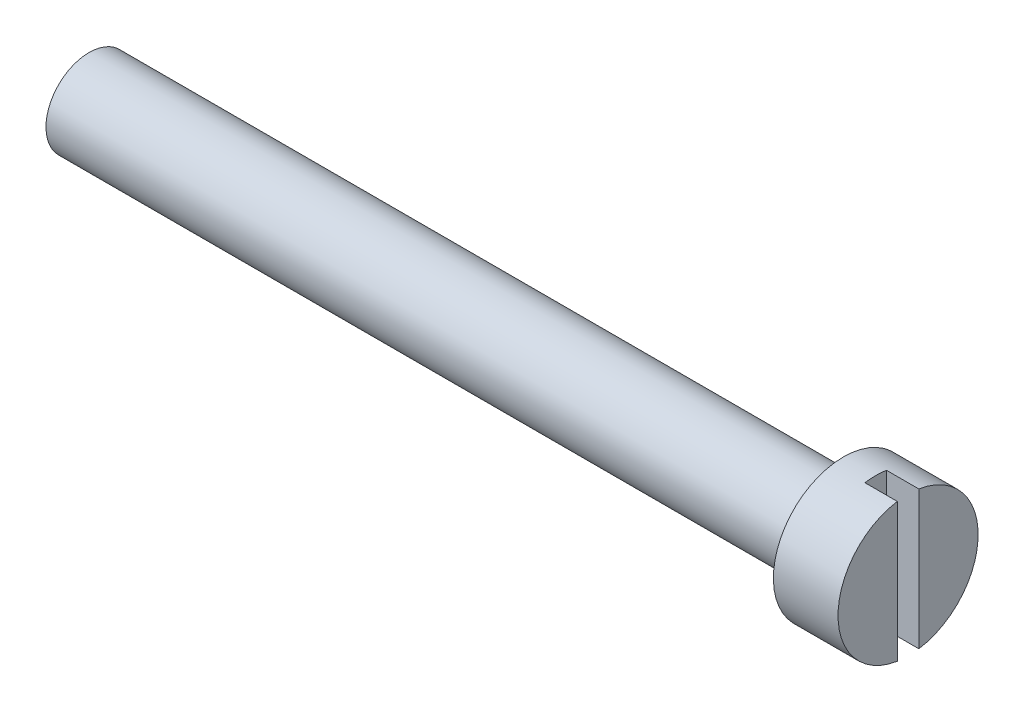
ISO-10303-21;
HEADER;
FILE_DESCRIPTION(('STEP AP214'),'2;1');
FILE_NAME('part.step','',(''),(''),'','','');
FILE_SCHEMA(('AUTOMOTIVE_DESIGN { 1 0 10303 214 1 1 1 1 }'));
ENDSEC;
DATA;
#1=APPLICATION_CONTEXT('core data for automotive mechanical design processes');
#2=APPLICATION_PROTOCOL_DEFINITION('international standard','automotive_design',2000,#1);
#3=PRODUCT_CONTEXT('',#1,'mechanical');
#4=PRODUCT('Part','Part','',(#3));
#5=PRODUCT_RELATED_PRODUCT_CATEGORY('part','',(#4));
#6=PRODUCT_DEFINITION_FORMATION('','',#4);
#7=PRODUCT_DEFINITION_CONTEXT('part definition',#1,'design');
#8=PRODUCT_DEFINITION('design','',#6,#7);
#9=PRODUCT_DEFINITION_SHAPE('','',#8);
#10=(LENGTH_UNIT() NAMED_UNIT(*) SI_UNIT(.MILLI.,.METRE.));
#11=(NAMED_UNIT(*) PLANE_ANGLE_UNIT() SI_UNIT($,.RADIAN.));
#12=(NAMED_UNIT(*) SI_UNIT($,.STERADIAN.) SOLID_ANGLE_UNIT());
#13=UNCERTAINTY_MEASURE_WITH_UNIT(LENGTH_MEASURE(1.E-05),#10,'distance_accuracy_value','');
#14=(GEOMETRIC_REPRESENTATION_CONTEXT(3) GLOBAL_UNCERTAINTY_ASSIGNED_CONTEXT((#13)) GLOBAL_UNIT_ASSIGNED_CONTEXT((#10,
#11,#12)) REPRESENTATION_CONTEXT('',''));
#15=CARTESIAN_POINT('',(0.,0.,0.));
#16=DIRECTION('',(0.,0.,1.));
#17=DIRECTION('',(1.,0.,0.));
#18=AXIS2_PLACEMENT_3D('',#15,#16,#17);
#19=CARTESIAN_POINT('',(0.,3.25,0.));
#20=DIRECTION('',(1.,0.,0.));
#21=DIRECTION('',(0.,1.,0.));
#22=AXIS2_PLACEMENT_3D('',#19,#20,#21);
#23=PLANE('',#22);
#24=DIRECTION('',(0.,1.,0.));
#25=VECTOR('',#24,1.);
#26=CARTESIAN_POINT('',(0.,-3.25,-0.5));
#27=LINE('',#26,#25);
#28=CARTESIAN_POINT('',(0.,-3.21130814466628,-0.5));
#29=VERTEX_POINT('',#28);
#30=CARTESIAN_POINT('',(0.,3.21130814466628,-0.5));
#31=VERTEX_POINT('',#30);
#32=EDGE_CURVE('E88',#29,#31,#27,.T.);
#33=ORIENTED_EDGE('',*,*,#32,.F.);
#34=CARTESIAN_POINT('',(0.,0.,0.));
#35=DIRECTION('',(1.,0.,0.));
#36=DIRECTION('',(0.,1.,0.));
#37=AXIS2_PLACEMENT_3D('',#34,#35,#36);
#38=CIRCLE('',#37,3.25);
#39=EDGE_CURVE('E99',#29,#31,#38,.T.);
#40=ORIENTED_EDGE('',*,*,#39,.T.);
#41=EDGE_LOOP('',(#33,#40));
#42=FACE_BOUND('',#41,.T.);
#43=ADVANCED_FACE('F45',(#42),#23,.T.);
#44=DIRECTION('',(0.,-1.,0.));
#45=VECTOR('',#44,1.);
#46=CARTESIAN_POINT('',(0.,-3.25,0.5));
#47=LINE('',#46,#45);
#48=CARTESIAN_POINT('',(0.,3.21130814466628,0.5));
#49=VERTEX_POINT('',#48);
#50=CARTESIAN_POINT('',(0.,-3.21130814466628,0.5));
#51=VERTEX_POINT('',#50);
#52=EDGE_CURVE('E101',#49,#51,#47,.T.);
#53=ORIENTED_EDGE('',*,*,#52,.F.);
#54=EDGE_CURVE('E106',#49,#51,#38,.T.);
#55=ORIENTED_EDGE('',*,*,#54,.T.);
#56=EDGE_LOOP('',(#53,#55));
#57=FACE_BOUND('',#56,.T.);
#58=ADVANCED_FACE('F47',(#57),#23,.T.);
#59=CARTESIAN_POINT('',(-38.,0.,0.));
#60=DIRECTION('',(-1.,0.,0.));
#61=DIRECTION('',(0.,-1.,0.));
#62=AXIS2_PLACEMENT_3D('',#59,#60,#61);
#63=PLANE('',#62);
#64=CARTESIAN_POINT('',(-38.,0.,0.));
#65=DIRECTION('',(1.,0.,0.));
#66=DIRECTION('',(0.,1.,0.));
#67=AXIS2_PLACEMENT_3D('',#64,#65,#66);
#68=CIRCLE('',#67,2.);
#69=CARTESIAN_POINT('',(-38.,2.,0.));
#70=VERTEX_POINT('',#69);
#71=EDGE_CURVE('E122',#70,#70,#68,.T.);
#72=ORIENTED_EDGE('',*,*,#71,.F.);
#73=EDGE_LOOP('',(#72));
#74=FACE_BOUND('',#73,.T.);
#75=ADVANCED_FACE('F154',(#74),#63,.T.);
#76=CARTESIAN_POINT('',(0.,0.,0.));
#77=DIRECTION('',(1.,0.,0.));
#78=DIRECTION('',(0.,1.,0.));
#79=AXIS2_PLACEMENT_3D('',#76,#77,#78);
#80=CYLINDRICAL_SURFACE('',#79,2.);
#81=ORIENTED_EDGE('',*,*,#71,.T.);
#82=EDGE_LOOP('',(#81));
#83=FACE_BOUND('',#82,.T.);
#84=CARTESIAN_POINT('',(-3.,0.,0.));
#85=DIRECTION('',(1.,0.,0.));
#86=DIRECTION('',(0.,1.,0.));
#87=AXIS2_PLACEMENT_3D('',#84,#85,#86);
#88=CIRCLE('',#87,2.);
#89=CARTESIAN_POINT('',(-3.,2.,0.));
#90=VERTEX_POINT('',#89);
#91=EDGE_CURVE('E118',#90,#90,#88,.T.);
#92=ORIENTED_EDGE('',*,*,#91,.F.);
#93=EDGE_LOOP('',(#92));
#94=FACE_BOUND('',#93,.T.);
#95=ADVANCED_FACE('F159',(#83,#94),#80,.T.);
#96=CARTESIAN_POINT('',(-3.,2.,0.));
#97=DIRECTION('',(-1.,0.,0.));
#98=DIRECTION('',(0.,-1.,0.));
#99=AXIS2_PLACEMENT_3D('',#96,#97,#98);
#100=PLANE('',#99);
#101=ORIENTED_EDGE('',*,*,#91,.T.);
#102=EDGE_LOOP('',(#101));
#103=FACE_BOUND('',#102,.T.);
#104=CARTESIAN_POINT('',(-3.,0.,0.));
#105=DIRECTION('',(1.,0.,0.));
#106=DIRECTION('',(0.,1.,0.));
#107=AXIS2_PLACEMENT_3D('',#104,#105,#106);
#108=CIRCLE('',#107,3.25);
#109=CARTESIAN_POINT('',(-3.,3.25,0.));
#110=VERTEX_POINT('',#109);
#111=EDGE_CURVE('E111',#110,#110,#108,.T.);
#112=ORIENTED_EDGE('',*,*,#111,.F.);
#113=EDGE_LOOP('',(#112));
#114=FACE_BOUND('',#113,.T.);
#115=ADVANCED_FACE('F164',(#103,#114),#100,.T.);
#116=CARTESIAN_POINT('',(0.,0.,0.));
#117=DIRECTION('',(1.,0.,0.));
#118=DIRECTION('',(0.,1.,0.));
#119=AXIS2_PLACEMENT_3D('',#116,#117,#118);
#120=CYLINDRICAL_SURFACE('',#119,3.25);
#121=DIRECTION('',(1.,0.,0.));
#122=VECTOR('',#121,1.);
#123=CARTESIAN_POINT('',(0.,3.21130814466628,-0.5));
#124=LINE('',#123,#122);
#125=CARTESIAN_POINT('',(-1.5,3.21130814466628,-0.5));
#126=VERTEX_POINT('',#125);
#127=EDGE_CURVE('E11',#31,#126,#124,.F.);
#128=ORIENTED_EDGE('',*,*,#127,.F.);
#129=ORIENTED_EDGE('',*,*,#39,.F.);
#130=DIRECTION('',(1.,0.,0.));
#131=VECTOR('',#130,1.);
#132=CARTESIAN_POINT('',(0.,-3.21130814466628,-0.5));
#133=LINE('',#132,#131);
#134=CARTESIAN_POINT('',(-1.5,-3.21130814466628,-0.5));
#135=VERTEX_POINT('',#134);
#136=EDGE_CURVE('E85',#135,#29,#133,.T.);
#137=ORIENTED_EDGE('',*,*,#136,.F.);
#138=CARTESIAN_POINT('',(-1.5,0.,0.));
#139=DIRECTION('',(-1.,0.,0.));
#140=DIRECTION('',(0.,-1.,0.));
#141=AXIS2_PLACEMENT_3D('',#138,#139,#140);
#142=CIRCLE('',#141,3.25);
#143=CARTESIAN_POINT('',(-1.5,-3.21130814466628,0.5));
#144=VERTEX_POINT('',#143);
#145=EDGE_CURVE('E126',#144,#135,#142,.F.);
#146=ORIENTED_EDGE('',*,*,#145,.F.);
#147=DIRECTION('',(1.,0.,0.));
#148=VECTOR('',#147,1.);
#149=CARTESIAN_POINT('',(0.,-3.21130814466628,0.5));
#150=LINE('',#149,#148);
#151=EDGE_CURVE('E95',#51,#144,#150,.F.);
#152=ORIENTED_EDGE('',*,*,#151,.F.);
#153=ORIENTED_EDGE('',*,*,#54,.F.);
#154=DIRECTION('',(1.,0.,0.));
#155=VECTOR('',#154,1.);
#156=CARTESIAN_POINT('',(0.,3.21130814466628,0.5));
#157=LINE('',#156,#155);
#158=CARTESIAN_POINT('',(-1.5,3.21130814466628,0.5));
#159=VERTEX_POINT('',#158);
#160=EDGE_CURVE('E54',#159,#49,#157,.T.);
#161=ORIENTED_EDGE('',*,*,#160,.F.);
#162=EDGE_CURVE('E66',#126,#159,#142,.F.);
#163=ORIENTED_EDGE('',*,*,#162,.F.);
#164=EDGE_LOOP('',(#128,#129,#137,#146,#152,#153,#161,#163));
#165=FACE_BOUND('',#164,.T.);
#166=ORIENTED_EDGE('',*,*,#111,.T.);
#167=EDGE_LOOP('',(#166));
#168=FACE_BOUND('',#167,.T.);
#169=ADVANCED_FACE('F103',(#165,#168),#120,.T.);
#170=CARTESIAN_POINT('',(-1.5,-3.25,-0.5));
#171=DIRECTION('',(0.,0.,-1.));
#172=DIRECTION('',(-1.,0.,0.));
#173=AXIS2_PLACEMENT_3D('',#170,#171,#172);
#174=PLANE('',#173);
#175=ORIENTED_EDGE('',*,*,#127,.T.);
#176=DIRECTION('',(0.,1.,0.));
#177=VECTOR('',#176,1.);
#178=CARTESIAN_POINT('',(-1.5,-3.25,-0.5));
#179=LINE('',#178,#177);
#180=EDGE_CURVE('E90',#135,#126,#179,.T.);
#181=ORIENTED_EDGE('',*,*,#180,.F.);
#182=ORIENTED_EDGE('',*,*,#136,.T.);
#183=ORIENTED_EDGE('',*,*,#32,.T.);
#184=EDGE_LOOP('',(#175,#181,#182,#183));
#185=FACE_BOUND('',#184,.T.);
#186=ADVANCED_FACE('F87',(#185),#174,.F.);
#187=CARTESIAN_POINT('',(-1.5,-3.25,0.5));
#188=DIRECTION('',(0.,0.,1.));
#189=DIRECTION('',(1.,0.,0.));
#190=AXIS2_PLACEMENT_3D('',#187,#188,#189);
#191=PLANE('',#190);
#192=ORIENTED_EDGE('',*,*,#151,.T.);
#193=DIRECTION('',(0.,-1.,0.));
#194=VECTOR('',#193,1.);
#195=CARTESIAN_POINT('',(-1.5,-3.25,0.5));
#196=LINE('',#195,#194);
#197=EDGE_CURVE('E61',#159,#144,#196,.T.);
#198=ORIENTED_EDGE('',*,*,#197,.F.);
#199=ORIENTED_EDGE('',*,*,#160,.T.);
#200=ORIENTED_EDGE('',*,*,#52,.T.);
#201=EDGE_LOOP('',(#192,#198,#199,#200));
#202=FACE_BOUND('',#201,.T.);
#203=ADVANCED_FACE('F135',(#202),#191,.F.);
#204=CARTESIAN_POINT('',(-1.5,0.,0.));
#205=DIRECTION('',(-1.,0.,0.));
#206=DIRECTION('',(0.,-1.,0.));
#207=AXIS2_PLACEMENT_3D('',#204,#205,#206);
#208=PLANE('',#207);
#209=ORIENTED_EDGE('',*,*,#180,.T.);
#210=ORIENTED_EDGE('',*,*,#162,.T.);
#211=ORIENTED_EDGE('',*,*,#197,.T.);
#212=ORIENTED_EDGE('',*,*,#145,.T.);
#213=EDGE_LOOP('',(#209,#210,#211,#212));
#214=FACE_BOUND('',#213,.T.);
#215=ADVANCED_FACE('F140',(#214),#208,.F.);
#216=CLOSED_SHELL('',(#43,#58,#75,#95,#115,#169,#186,#203,#215));
#217=MANIFOLD_SOLID_BREP('B2',#216);
#218=ADVANCED_BREP_SHAPE_REPRESENTATION('',(#18,#217),#14);
#219=SHAPE_DEFINITION_REPRESENTATION(#9,#218);
ENDSEC;
END-ISO-10303-21;
